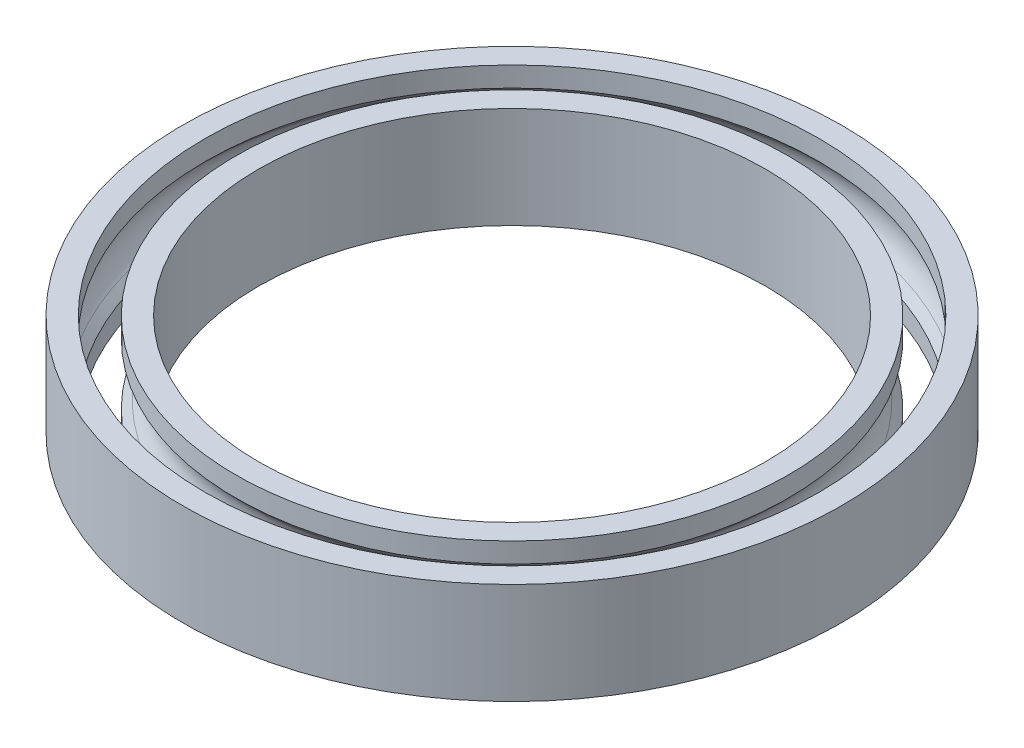
ISO-10303-21;
HEADER;
FILE_DESCRIPTION(('STEP AP214'),'2;1');
FILE_NAME('part.step','',(''),(''),'','','');
FILE_SCHEMA(('AUTOMOTIVE_DESIGN { 1 0 10303 214 1 1 1 1 }'));
ENDSEC;
DATA;
#1=APPLICATION_CONTEXT('core data for automotive mechanical design processes');
#2=APPLICATION_PROTOCOL_DEFINITION('international standard','automotive_design',2000,#1);
#3=PRODUCT_CONTEXT('',#1,'mechanical');
#4=PRODUCT('Part','Part','',(#3));
#5=PRODUCT_RELATED_PRODUCT_CATEGORY('part','',(#4));
#6=PRODUCT_DEFINITION_FORMATION('','',#4);
#7=PRODUCT_DEFINITION_CONTEXT('part definition',#1,'design');
#8=PRODUCT_DEFINITION('design','',#6,#7);
#9=PRODUCT_DEFINITION_SHAPE('','',#8);
#10=(LENGTH_UNIT() NAMED_UNIT(*) SI_UNIT(.MILLI.,.METRE.));
#11=(NAMED_UNIT(*) PLANE_ANGLE_UNIT() SI_UNIT($,.RADIAN.));
#12=(NAMED_UNIT(*) SI_UNIT($,.STERADIAN.) SOLID_ANGLE_UNIT());
#13=UNCERTAINTY_MEASURE_WITH_UNIT(LENGTH_MEASURE(1.E-05),#10,'distance_accuracy_value','');
#14=(GEOMETRIC_REPRESENTATION_CONTEXT(3) GLOBAL_UNCERTAINTY_ASSIGNED_CONTEXT((#13)) GLOBAL_UNIT_ASSIGNED_CONTEXT((#10,
#11,#12)) REPRESENTATION_CONTEXT('',''));
#15=CARTESIAN_POINT('',(0.,0.,0.));
#16=DIRECTION('',(0.,0.,1.));
#17=DIRECTION('',(1.,0.,0.));
#18=AXIS2_PLACEMENT_3D('',#15,#16,#17);
#19=CARTESIAN_POINT('',(0.,0.,0.));
#20=DIRECTION('',(0.,-1.,0.));
#21=DIRECTION('',(0.,0.,-1.));
#22=AXIS2_PLACEMENT_3D('',#19,#20,#21);
#23=CYLINDRICAL_SURFACE('',#22,30.25);
#24=CARTESIAN_POINT('',(0.,3.0254833995939,0.));
#25=DIRECTION('',(0.,-1.,0.));
#26=DIRECTION('',(0.,0.,-1.));
#27=AXIS2_PLACEMENT_3D('',#24,#25,#26);
#28=CIRCLE('',#27,30.25);
#29=CARTESIAN_POINT('',(0.,3.0254833995939,-30.25));
#30=VERTEX_POINT('',#29);
#31=EDGE_CURVE('E11',#30,#30,#28,.T.);
#32=ORIENTED_EDGE('',*,*,#31,.T.);
#33=EDGE_LOOP('',(#32));
#34=FACE_BOUND('',#33,.T.);
#35=CARTESIAN_POINT('',(0.,5.,0.));
#36=DIRECTION('',(0.,-1.,0.));
#37=DIRECTION('',(0.,0.,-1.));
#38=AXIS2_PLACEMENT_3D('',#35,#36,#37);
#39=CIRCLE('',#38,30.25);
#40=CARTESIAN_POINT('',(0.,5.,-30.25));
#41=VERTEX_POINT('',#40);
#42=EDGE_CURVE('E59',#41,#41,#39,.T.);
#43=ORIENTED_EDGE('',*,*,#42,.F.);
#44=EDGE_LOOP('',(#43));
#45=FACE_BOUND('',#44,.T.);
#46=ADVANCED_FACE('F45',(#34,#45),#23,.F.);
#47=CARTESIAN_POINT('',(0.,3.0254833995939,0.));
#48=DIRECTION('',(0.,-1.,0.));
#49=DIRECTION('',(0.,0.,-1.));
#50=AXIS2_PLACEMENT_3D('',#47,#48,#49);
#51=CONICAL_SURFACE('',#50,30.25,0.785398163397445);
#52=CARTESIAN_POINT('',(0.,2.26274169979695,0.));
#53=DIRECTION('',(0.,-1.,0.));
#54=DIRECTION('',(0.,0.,-1.));
#55=AXIS2_PLACEMENT_3D('',#52,#53,#54);
#56=CIRCLE('',#55,31.012741699797);
#57=CARTESIAN_POINT('',(0.,2.26274169979695,-31.012741699797));
#58=VERTEX_POINT('',#57);
#59=EDGE_CURVE('E51',#58,#58,#56,.T.);
#60=ORIENTED_EDGE('',*,*,#59,.T.);
#61=EDGE_LOOP('',(#60));
#62=FACE_BOUND('',#61,.T.);
#63=ORIENTED_EDGE('',*,*,#31,.F.);
#64=EDGE_LOOP('',(#63));
#65=FACE_BOUND('',#64,.T.);
#66=ADVANCED_FACE('F99',(#62,#65),#51,.F.);
#67=CARTESIAN_POINT('',(0.,0.,0.));
#68=DIRECTION('',(0.,-1.,0.));
#69=DIRECTION('',(0.,0.,-1.));
#70=AXIS2_PLACEMENT_3D('',#67,#68,#69);
#71=TOROIDAL_SURFACE('',#70,28.75,3.2);
#72=ORIENTED_EDGE('',*,*,#59,.F.);
#73=EDGE_LOOP('',(#72));
#74=FACE_BOUND('',#73,.T.);
#75=CARTESIAN_POINT('',(0.,-2.26274169979695,0.));
#76=DIRECTION('',(0.,-1.,0.));
#77=DIRECTION('',(0.,0.,-1.));
#78=AXIS2_PLACEMENT_3D('',#75,#76,#77);
#79=CIRCLE('',#78,31.012741699797);
#80=CARTESIAN_POINT('',(0.,-2.26274169979695,-31.012741699797));
#81=VERTEX_POINT('',#80);
#82=EDGE_CURVE('E67',#81,#81,#79,.T.);
#83=ORIENTED_EDGE('',*,*,#82,.T.);
#84=EDGE_LOOP('',(#83));
#85=FACE_BOUND('',#84,.T.);
#86=ADVANCED_FACE('F89',(#74,#85),#71,.F.);
#87=CARTESIAN_POINT('',(0.,0.,0.));
#88=DIRECTION('',(0.,-1.,0.));
#89=DIRECTION('',(0.,0.,-1.));
#90=AXIS2_PLACEMENT_3D('',#87,#88,#89);
#91=CYLINDRICAL_SURFACE('',#90,32.5);
#92=CARTESIAN_POINT('',(0.,5.,0.));
#93=DIRECTION('',(0.,-1.,0.));
#94=DIRECTION('',(0.,0.,-1.));
#95=AXIS2_PLACEMENT_3D('',#92,#93,#94);
#96=CIRCLE('',#95,32.5);
#97=CARTESIAN_POINT('',(0.,5.,-32.5));
#98=VERTEX_POINT('',#97);
#99=EDGE_CURVE('E55',#98,#98,#96,.T.);
#100=ORIENTED_EDGE('',*,*,#99,.T.);
#101=EDGE_LOOP('',(#100));
#102=FACE_BOUND('',#101,.T.);
#103=CARTESIAN_POINT('',(0.,-5.,0.));
#104=DIRECTION('',(0.,-1.,0.));
#105=DIRECTION('',(0.,0.,-1.));
#106=AXIS2_PLACEMENT_3D('',#103,#104,#105);
#107=CIRCLE('',#106,32.5);
#108=CARTESIAN_POINT('',(0.,-5.,-32.5));
#109=VERTEX_POINT('',#108);
#110=EDGE_CURVE('E70',#109,#109,#107,.T.);
#111=ORIENTED_EDGE('',*,*,#110,.F.);
#112=EDGE_LOOP('',(#111));
#113=FACE_BOUND('',#112,.T.);
#114=ADVANCED_FACE('F86',(#102,#113),#91,.T.);
#115=CARTESIAN_POINT('',(30.25,5.,0.));
#116=DIRECTION('',(0.,1.,0.));
#117=DIRECTION('',(0.,0.,1.));
#118=AXIS2_PLACEMENT_3D('',#115,#116,#117);
#119=PLANE('',#118);
#120=ORIENTED_EDGE('',*,*,#42,.T.);
#121=EDGE_LOOP('',(#120));
#122=FACE_BOUND('',#121,.T.);
#123=ORIENTED_EDGE('',*,*,#99,.F.);
#124=EDGE_LOOP('',(#123));
#125=FACE_BOUND('',#124,.T.);
#126=ADVANCED_FACE('F88',(#122,#125),#119,.T.);
#127=CARTESIAN_POINT('',(0.,0.,0.));
#128=DIRECTION('',(0.,1.,0.));
#129=DIRECTION('',(0.,0.,-1.));
#130=AXIS2_PLACEMENT_3D('',#127,#128,#129);
#131=CYLINDRICAL_SURFACE('',#130,30.25);
#132=CARTESIAN_POINT('',(0.,-3.0254833995939,0.));
#133=DIRECTION('',(0.,-1.,0.));
#134=DIRECTION('',(0.,0.,-1.));
#135=AXIS2_PLACEMENT_3D('',#132,#133,#134);
#136=CIRCLE('',#135,30.25);
#137=CARTESIAN_POINT('',(0.,-3.0254833995939,-30.25));
#138=VERTEX_POINT('',#137);
#139=EDGE_CURVE('E64',#138,#138,#136,.T.);
#140=ORIENTED_EDGE('',*,*,#139,.F.);
#141=EDGE_LOOP('',(#140));
#142=FACE_BOUND('',#141,.T.);
#143=CARTESIAN_POINT('',(0.,-5.,0.));
#144=DIRECTION('',(0.,-1.,0.));
#145=DIRECTION('',(0.,0.,-1.));
#146=AXIS2_PLACEMENT_3D('',#143,#144,#145);
#147=CIRCLE('',#146,30.25);
#148=CARTESIAN_POINT('',(0.,-5.,-30.25));
#149=VERTEX_POINT('',#148);
#150=EDGE_CURVE('E73',#149,#149,#147,.T.);
#151=ORIENTED_EDGE('',*,*,#150,.T.);
#152=EDGE_LOOP('',(#151));
#153=FACE_BOUND('',#152,.T.);
#154=ADVANCED_FACE('F77',(#142,#153),#131,.F.);
#155=CARTESIAN_POINT('',(0.,-3.0254833995939,0.));
#156=DIRECTION('',(0.,1.,0.));
#157=DIRECTION('',(0.,0.,-1.));
#158=AXIS2_PLACEMENT_3D('',#155,#156,#157);
#159=CONICAL_SURFACE('',#158,30.25,0.785398163397445);
#160=ORIENTED_EDGE('',*,*,#82,.F.);
#161=EDGE_LOOP('',(#160));
#162=FACE_BOUND('',#161,.T.);
#163=ORIENTED_EDGE('',*,*,#139,.T.);
#164=EDGE_LOOP('',(#163));
#165=FACE_BOUND('',#164,.T.);
#166=ADVANCED_FACE('F82',(#162,#165),#159,.F.);
#167=CARTESIAN_POINT('',(30.25,-5.,0.));
#168=DIRECTION('',(0.,-1.,0.));
#169=DIRECTION('',(0.,0.,1.));
#170=AXIS2_PLACEMENT_3D('',#167,#168,#169);
#171=PLANE('',#170);
#172=ORIENTED_EDGE('',*,*,#150,.F.);
#173=EDGE_LOOP('',(#172));
#174=FACE_BOUND('',#173,.T.);
#175=ORIENTED_EDGE('',*,*,#110,.T.);
#176=EDGE_LOOP('',(#175));
#177=FACE_BOUND('',#176,.T.);
#178=ADVANCED_FACE('F79',(#174,#177),#171,.T.);
#179=CLOSED_SHELL('',(#46,#66,#86,#114,#126,#154,#166,#178));
#180=MANIFOLD_SOLID_BREP('B2',#179);
#181=CARTESIAN_POINT('',(0.,0.,0.));
#182=DIRECTION('',(0.,-1.,0.));
#183=DIRECTION('',(0.,0.,-1.));
#184=AXIS2_PLACEMENT_3D('',#181,#182,#183);
#185=TOROIDAL_SURFACE('',#184,28.75,3.2);
#186=CARTESIAN_POINT('',(0.,2.26274169979694,0.));
#187=DIRECTION('',(0.,-1.,0.));
#188=DIRECTION('',(0.,0.,-1.));
#189=AXIS2_PLACEMENT_3D('',#186,#187,#188);
#190=CIRCLE('',#189,26.487258300203);
#191=CARTESIAN_POINT('',(0.,2.26274169979694,-26.487258300203));
#192=VERTEX_POINT('',#191);
#193=EDGE_CURVE('E187',#192,#192,#190,.T.);
#194=ORIENTED_EDGE('',*,*,#193,.T.);
#195=EDGE_LOOP('',(#194));
#196=FACE_BOUND('',#195,.T.);
#197=CARTESIAN_POINT('',(0.,-2.26274169979694,0.));
#198=DIRECTION('',(0.,-1.,0.));
#199=DIRECTION('',(0.,0.,-1.));
#200=AXIS2_PLACEMENT_3D('',#197,#198,#199);
#201=CIRCLE('',#200,26.487258300203);
#202=CARTESIAN_POINT('',(0.,-2.26274169979694,-26.487258300203));
#203=VERTEX_POINT('',#202);
#204=EDGE_CURVE('E201',#203,#203,#201,.T.);
#205=ORIENTED_EDGE('',*,*,#204,.F.);
#206=EDGE_LOOP('',(#205));
#207=FACE_BOUND('',#206,.T.);
#208=ADVANCED_FACE('F173',(#196,#207),#185,.F.);
#209=CARTESIAN_POINT('',(0.,0.,0.));
#210=DIRECTION('',(0.,-1.,0.));
#211=DIRECTION('',(0.,0.,-1.));
#212=AXIS2_PLACEMENT_3D('',#209,#210,#211);
#213=CYLINDRICAL_SURFACE('',#212,25.);
#214=CARTESIAN_POINT('',(0.,5.,0.));
#215=DIRECTION('',(0.,-1.,0.));
#216=DIRECTION('',(0.,0.,-1.));
#217=AXIS2_PLACEMENT_3D('',#214,#215,#216);
#218=CIRCLE('',#217,25.);
#219=CARTESIAN_POINT('',(0.,5.,-25.));
#220=VERTEX_POINT('',#219);
#221=EDGE_CURVE('E44',#220,#220,#218,.T.);
#222=ORIENTED_EDGE('',*,*,#221,.F.);
#223=EDGE_LOOP('',(#222));
#224=FACE_BOUND('',#223,.T.);
#225=CARTESIAN_POINT('',(0.,-5.,0.));
#226=DIRECTION('',(0.,-1.,0.));
#227=DIRECTION('',(0.,0.,-1.));
#228=AXIS2_PLACEMENT_3D('',#225,#226,#227);
#229=CIRCLE('',#228,25.);
#230=CARTESIAN_POINT('',(0.,-5.,-25.));
#231=VERTEX_POINT('',#230);
#232=EDGE_CURVE('E192',#231,#231,#229,.T.);
#233=ORIENTED_EDGE('',*,*,#232,.T.);
#234=EDGE_LOOP('',(#233));
#235=FACE_BOUND('',#234,.T.);
#236=ADVANCED_FACE('F208',(#224,#235),#213,.F.);
#237=CARTESIAN_POINT('',(27.25,5.,0.));
#238=DIRECTION('',(0.,1.,0.));
#239=DIRECTION('',(0.,0.,1.));
#240=AXIS2_PLACEMENT_3D('',#237,#238,#239);
#241=PLANE('',#240);
#242=ORIENTED_EDGE('',*,*,#221,.T.);
#243=EDGE_LOOP('',(#242));
#244=FACE_BOUND('',#243,.T.);
#245=CARTESIAN_POINT('',(0.,5.,0.));
#246=DIRECTION('',(0.,-1.,0.));
#247=DIRECTION('',(0.,0.,-1.));
#248=AXIS2_PLACEMENT_3D('',#245,#246,#247);
#249=CIRCLE('',#248,27.25);
#250=CARTESIAN_POINT('',(0.,5.,-27.25));
#251=VERTEX_POINT('',#250);
#252=EDGE_CURVE('E179',#251,#251,#249,.T.);
#253=ORIENTED_EDGE('',*,*,#252,.F.);
#254=EDGE_LOOP('',(#253));
#255=FACE_BOUND('',#254,.T.);
#256=ADVANCED_FACE('F214',(#244,#255),#241,.T.);
#257=CARTESIAN_POINT('',(0.,0.,0.));
#258=DIRECTION('',(0.,-1.,0.));
#259=DIRECTION('',(0.,0.,-1.));
#260=AXIS2_PLACEMENT_3D('',#257,#258,#259);
#261=CYLINDRICAL_SURFACE('',#260,27.25);
#262=ORIENTED_EDGE('',*,*,#252,.T.);
#263=EDGE_LOOP('',(#262));
#264=FACE_BOUND('',#263,.T.);
#265=CARTESIAN_POINT('',(0.,3.0254833995939,0.));
#266=DIRECTION('',(0.,-1.,0.));
#267=DIRECTION('',(0.,0.,-1.));
#268=AXIS2_PLACEMENT_3D('',#265,#266,#267);
#269=CIRCLE('',#268,27.25);
#270=CARTESIAN_POINT('',(0.,3.0254833995939,-27.25));
#271=VERTEX_POINT('',#270);
#272=EDGE_CURVE('E183',#271,#271,#269,.T.);
#273=ORIENTED_EDGE('',*,*,#272,.F.);
#274=EDGE_LOOP('',(#273));
#275=FACE_BOUND('',#274,.T.);
#276=ADVANCED_FACE('F221',(#264,#275),#261,.T.);
#277=CARTESIAN_POINT('',(0.,2.26274169979694,0.));
#278=DIRECTION('',(0.,1.,0.));
#279=DIRECTION('',(0.,0.,1.));
#280=AXIS2_PLACEMENT_3D('',#277,#278,#279);
#281=CONICAL_SURFACE('',#280,26.487258300203,0.785398163397442);
#282=ORIENTED_EDGE('',*,*,#272,.T.);
#283=EDGE_LOOP('',(#282));
#284=FACE_BOUND('',#283,.T.);
#285=ORIENTED_EDGE('',*,*,#193,.F.);
#286=EDGE_LOOP('',(#285));
#287=FACE_BOUND('',#286,.T.);
#288=ADVANCED_FACE('F218',(#284,#287),#281,.T.);
#289=CARTESIAN_POINT('',(27.25,-5.,0.));
#290=DIRECTION('',(0.,-1.,0.));
#291=DIRECTION('',(0.,0.,1.));
#292=AXIS2_PLACEMENT_3D('',#289,#290,#291);
#293=PLANE('',#292);
#294=ORIENTED_EDGE('',*,*,#232,.F.);
#295=EDGE_LOOP('',(#294));
#296=FACE_BOUND('',#295,.T.);
#297=CARTESIAN_POINT('',(0.,-5.,0.));
#298=DIRECTION('',(0.,-1.,0.));
#299=DIRECTION('',(0.,0.,-1.));
#300=AXIS2_PLACEMENT_3D('',#297,#298,#299);
#301=CIRCLE('',#300,27.25);
#302=CARTESIAN_POINT('',(0.,-5.,-27.25));
#303=VERTEX_POINT('',#302);
#304=EDGE_CURVE('E195',#303,#303,#301,.T.);
#305=ORIENTED_EDGE('',*,*,#304,.T.);
#306=EDGE_LOOP('',(#305));
#307=FACE_BOUND('',#306,.T.);
#308=ADVANCED_FACE('F220',(#296,#307),#293,.T.);
#309=CARTESIAN_POINT('',(0.,0.,0.));
#310=DIRECTION('',(0.,1.,0.));
#311=DIRECTION('',(0.,0.,-1.));
#312=AXIS2_PLACEMENT_3D('',#309,#310,#311);
#313=CYLINDRICAL_SURFACE('',#312,27.25);
#314=ORIENTED_EDGE('',*,*,#304,.F.);
#315=EDGE_LOOP('',(#314));
#316=FACE_BOUND('',#315,.T.);
#317=CARTESIAN_POINT('',(0.,-3.0254833995939,0.));
#318=DIRECTION('',(0.,-1.,0.));
#319=DIRECTION('',(0.,0.,-1.));
#320=AXIS2_PLACEMENT_3D('',#317,#318,#319);
#321=CIRCLE('',#320,27.25);
#322=CARTESIAN_POINT('',(0.,-3.0254833995939,-27.25));
#323=VERTEX_POINT('',#322);
#324=EDGE_CURVE('E198',#323,#323,#321,.T.);
#325=ORIENTED_EDGE('',*,*,#324,.T.);
#326=EDGE_LOOP('',(#325));
#327=FACE_BOUND('',#326,.T.);
#328=ADVANCED_FACE('F228',(#316,#327),#313,.T.);
#329=CARTESIAN_POINT('',(0.,-2.26274169979694,0.));
#330=DIRECTION('',(0.,-1.,0.));
#331=DIRECTION('',(0.,0.,1.));
#332=AXIS2_PLACEMENT_3D('',#329,#330,#331);
#333=CONICAL_SURFACE('',#332,26.487258300203,0.785398163397442);
#334=ORIENTED_EDGE('',*,*,#324,.F.);
#335=EDGE_LOOP('',(#334));
#336=FACE_BOUND('',#335,.T.);
#337=ORIENTED_EDGE('',*,*,#204,.T.);
#338=EDGE_LOOP('',(#337));
#339=FACE_BOUND('',#338,.T.);
#340=ADVANCED_FACE('F205',(#336,#339),#333,.T.);
#341=CLOSED_SHELL('',(#208,#236,#256,#276,#288,#308,#328,#340));
#342=MANIFOLD_SOLID_BREP('B6',#341);
#343=ADVANCED_BREP_SHAPE_REPRESENTATION('',(#18,#180,#342),#14);
#344=SHAPE_DEFINITION_REPRESENTATION(#9,#343);
ENDSEC;
END-ISO-10303-21;
